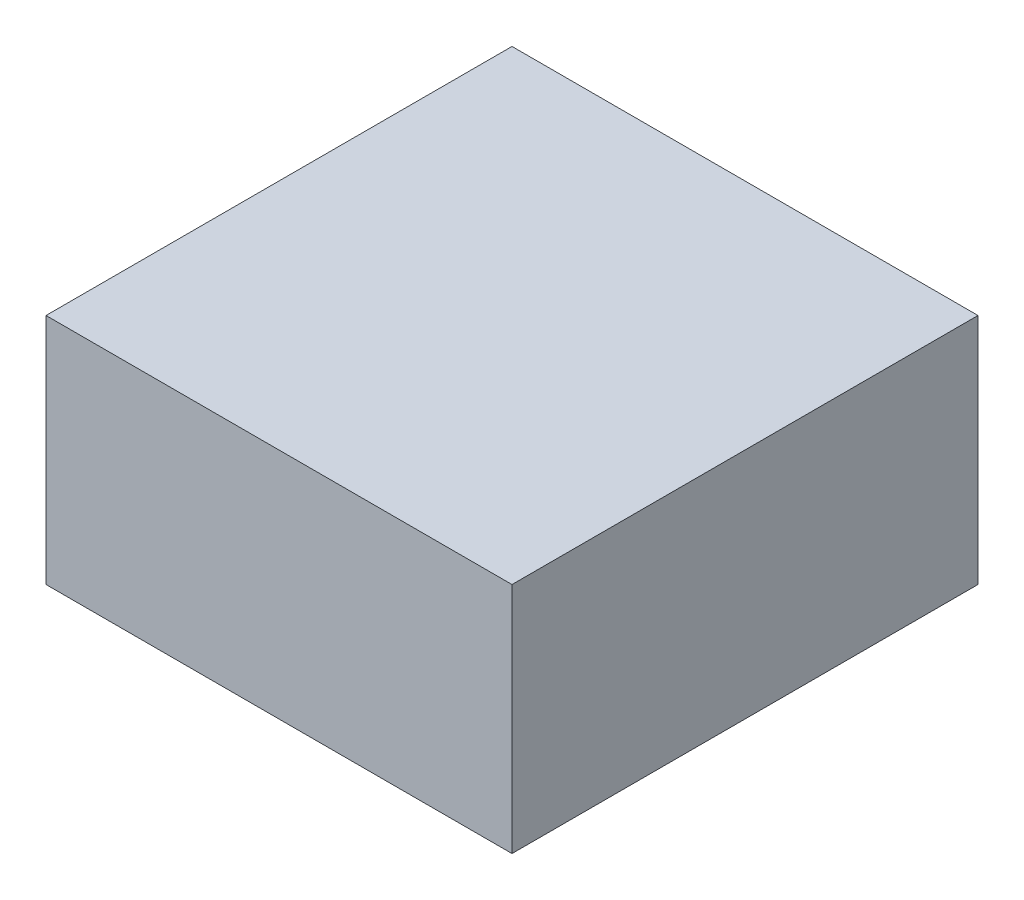
ISO-10303-21;
HEADER;
FILE_DESCRIPTION(('STEP AP214'),'2;1');
FILE_NAME('part.step','',(''),(''),'','','');
FILE_SCHEMA(('AUTOMOTIVE_DESIGN { 1 0 10303 214 1 1 1 1 }'));
ENDSEC;
DATA;
#1=APPLICATION_CONTEXT('core data for automotive mechanical design processes');
#2=APPLICATION_PROTOCOL_DEFINITION('international standard','automotive_design',2000,#1);
#3=PRODUCT_CONTEXT('',#1,'mechanical');
#4=PRODUCT('Part','Part','',(#3));
#5=PRODUCT_RELATED_PRODUCT_CATEGORY('part','',(#4));
#6=PRODUCT_DEFINITION_FORMATION('','',#4);
#7=PRODUCT_DEFINITION_CONTEXT('part definition',#1,'design');
#8=PRODUCT_DEFINITION('design','',#6,#7);
#9=PRODUCT_DEFINITION_SHAPE('','',#8);
#10=(LENGTH_UNIT() NAMED_UNIT(*) SI_UNIT(.MILLI.,.METRE.));
#11=(NAMED_UNIT(*) PLANE_ANGLE_UNIT() SI_UNIT($,.RADIAN.));
#12=(NAMED_UNIT(*) SI_UNIT($,.STERADIAN.) SOLID_ANGLE_UNIT());
#13=UNCERTAINTY_MEASURE_WITH_UNIT(LENGTH_MEASURE(1.E-05),#10,'distance_accuracy_value','');
#14=(GEOMETRIC_REPRESENTATION_CONTEXT(3) GLOBAL_UNCERTAINTY_ASSIGNED_CONTEXT((#13)) GLOBAL_UNIT_ASSIGNED_CONTEXT((#10,
#11,#12)) REPRESENTATION_CONTEXT('',''));
#15=CARTESIAN_POINT('',(0.,0.,0.));
#16=DIRECTION('',(0.,0.,1.));
#17=DIRECTION('',(1.,0.,0.));
#18=AXIS2_PLACEMENT_3D('',#15,#16,#17);
#19=CARTESIAN_POINT('',(0.,0.,6.));
#20=DIRECTION('',(0.,0.,1.));
#21=DIRECTION('',(1.,0.,0.));
#22=AXIS2_PLACEMENT_3D('',#19,#20,#21);
#23=PLANE('',#22);
#24=DIRECTION('',(-1.,0.,0.));
#25=VECTOR('',#24,1.);
#26=CARTESIAN_POINT('',(0.,-3.,6.));
#27=LINE('',#26,#25);
#28=CARTESIAN_POINT('',(6.,-3.,6.));
#29=VERTEX_POINT('',#28);
#30=CARTESIAN_POINT('',(-6.,-3.,6.));
#31=VERTEX_POINT('',#30);
#32=EDGE_CURVE('E11',#29,#31,#27,.T.);
#33=ORIENTED_EDGE('',*,*,#32,.F.);
#34=DIRECTION('',(0.,-1.,0.));
#35=VECTOR('',#34,1.);
#36=CARTESIAN_POINT('',(6.,0.,6.));
#37=LINE('',#36,#35);
#38=CARTESIAN_POINT('',(6.,3.,6.));
#39=VERTEX_POINT('',#38);
#40=EDGE_CURVE('E61',#39,#29,#37,.T.);
#41=ORIENTED_EDGE('',*,*,#40,.F.);
#42=DIRECTION('',(1.,0.,0.));
#43=VECTOR('',#42,1.);
#44=CARTESIAN_POINT('',(0.,3.,6.));
#45=LINE('',#44,#43);
#46=CARTESIAN_POINT('',(-6.,3.,6.));
#47=VERTEX_POINT('',#46);
#48=EDGE_CURVE('E87',#47,#39,#45,.T.);
#49=ORIENTED_EDGE('',*,*,#48,.F.);
#50=DIRECTION('',(0.,1.,0.));
#51=VECTOR('',#50,1.);
#52=CARTESIAN_POINT('',(-6.,0.,6.));
#53=LINE('',#52,#51);
#54=EDGE_CURVE('E24',#31,#47,#53,.T.);
#55=ORIENTED_EDGE('',*,*,#54,.F.);
#56=EDGE_LOOP('',(#33,#41,#49,#55));
#57=FACE_BOUND('',#56,.T.);
#58=ADVANCED_FACE('F17',(#57),#23,.T.);
#59=CARTESIAN_POINT('',(0.,-3.,-6.));
#60=DIRECTION('',(0.,-1.,0.));
#61=DIRECTION('',(0.,0.,-1.));
#62=AXIS2_PLACEMENT_3D('',#59,#60,#61);
#63=PLANE('',#62);
#64=DIRECTION('',(0.,0.,1.));
#65=VECTOR('',#64,1.);
#66=CARTESIAN_POINT('',(6.,-3.,-6.));
#67=LINE('',#66,#65);
#68=CARTESIAN_POINT('',(6.,-3.,-6.));
#69=VERTEX_POINT('',#68);
#70=EDGE_CURVE('E53',#69,#29,#67,.T.);
#71=ORIENTED_EDGE('',*,*,#70,.T.);
#72=ORIENTED_EDGE('',*,*,#32,.T.);
#73=DIRECTION('',(0.,0.,1.));
#74=VECTOR('',#73,1.);
#75=CARTESIAN_POINT('',(-6.,-3.,-6.));
#76=LINE('',#75,#74);
#77=CARTESIAN_POINT('',(-6.,-3.,-6.));
#78=VERTEX_POINT('',#77);
#79=EDGE_CURVE('E70',#78,#31,#76,.T.);
#80=ORIENTED_EDGE('',*,*,#79,.F.);
#81=DIRECTION('',(1.,0.,0.));
#82=VECTOR('',#81,1.);
#83=CARTESIAN_POINT('',(0.,-3.,-6.));
#84=LINE('',#83,#82);
#85=EDGE_CURVE('E65',#78,#69,#84,.T.);
#86=ORIENTED_EDGE('',*,*,#85,.T.);
#87=EDGE_LOOP('',(#71,#72,#80,#86));
#88=FACE_BOUND('',#87,.T.);
#89=ADVANCED_FACE('F66',(#88),#63,.T.);
#90=CARTESIAN_POINT('',(-6.,0.,-6.));
#91=DIRECTION('',(-1.,0.,0.));
#92=DIRECTION('',(0.,0.,1.));
#93=AXIS2_PLACEMENT_3D('',#90,#91,#92);
#94=PLANE('',#93);
#95=ORIENTED_EDGE('',*,*,#79,.T.);
#96=ORIENTED_EDGE('',*,*,#54,.T.);
#97=DIRECTION('',(0.,0.,1.));
#98=VECTOR('',#97,1.);
#99=CARTESIAN_POINT('',(-6.,3.,-6.));
#100=LINE('',#99,#98);
#101=CARTESIAN_POINT('',(-6.,3.,-6.));
#102=VERTEX_POINT('',#101);
#103=EDGE_CURVE('E85',#102,#47,#100,.T.);
#104=ORIENTED_EDGE('',*,*,#103,.F.);
#105=DIRECTION('',(0.,-1.,0.));
#106=VECTOR('',#105,1.);
#107=CARTESIAN_POINT('',(-6.,0.,-6.));
#108=LINE('',#107,#106);
#109=EDGE_CURVE('E75',#102,#78,#108,.T.);
#110=ORIENTED_EDGE('',*,*,#109,.T.);
#111=EDGE_LOOP('',(#95,#96,#104,#110));
#112=FACE_BOUND('',#111,.T.);
#113=ADVANCED_FACE('F93',(#112),#94,.T.);
#114=CARTESIAN_POINT('',(0.,3.,-6.));
#115=DIRECTION('',(0.,1.,0.));
#116=DIRECTION('',(0.,0.,1.));
#117=AXIS2_PLACEMENT_3D('',#114,#115,#116);
#118=PLANE('',#117);
#119=ORIENTED_EDGE('',*,*,#103,.T.);
#120=ORIENTED_EDGE('',*,*,#48,.T.);
#121=DIRECTION('',(0.,0.,1.));
#122=VECTOR('',#121,1.);
#123=CARTESIAN_POINT('',(6.,3.,-6.));
#124=LINE('',#123,#122);
#125=CARTESIAN_POINT('',(6.,3.,-6.));
#126=VERTEX_POINT('',#125);
#127=EDGE_CURVE('E62',#126,#39,#124,.T.);
#128=ORIENTED_EDGE('',*,*,#127,.F.);
#129=DIRECTION('',(-1.,0.,0.));
#130=VECTOR('',#129,1.);
#131=CARTESIAN_POINT('',(0.,3.,-6.));
#132=LINE('',#131,#130);
#133=EDGE_CURVE('E76',#126,#102,#132,.T.);
#134=ORIENTED_EDGE('',*,*,#133,.T.);
#135=EDGE_LOOP('',(#119,#120,#128,#134));
#136=FACE_BOUND('',#135,.T.);
#137=ADVANCED_FACE('F90',(#136),#118,.T.);
#138=CARTESIAN_POINT('',(0.,0.,-6.));
#139=DIRECTION('',(0.,0.,-1.));
#140=DIRECTION('',(-1.,0.,0.));
#141=AXIS2_PLACEMENT_3D('',#138,#139,#140);
#142=PLANE('',#141);
#143=DIRECTION('',(0.,1.,0.));
#144=VECTOR('',#143,1.);
#145=CARTESIAN_POINT('',(6.,0.,-6.));
#146=LINE('',#145,#144);
#147=EDGE_CURVE('E56',#69,#126,#146,.T.);
#148=ORIENTED_EDGE('',*,*,#147,.F.);
#149=ORIENTED_EDGE('',*,*,#85,.F.);
#150=ORIENTED_EDGE('',*,*,#109,.F.);
#151=ORIENTED_EDGE('',*,*,#133,.F.);
#152=EDGE_LOOP('',(#148,#149,#150,#151));
#153=FACE_BOUND('',#152,.T.);
#154=ADVANCED_FACE('F72',(#153),#142,.T.);
#155=CARTESIAN_POINT('',(6.,0.,-6.));
#156=DIRECTION('',(1.,0.,0.));
#157=DIRECTION('',(0.,0.,-1.));
#158=AXIS2_PLACEMENT_3D('',#155,#156,#157);
#159=PLANE('',#158);
#160=ORIENTED_EDGE('',*,*,#147,.T.);
#161=ORIENTED_EDGE('',*,*,#127,.T.);
#162=ORIENTED_EDGE('',*,*,#40,.T.);
#163=ORIENTED_EDGE('',*,*,#70,.F.);
#164=EDGE_LOOP('',(#160,#161,#162,#163));
#165=FACE_BOUND('',#164,.T.);
#166=ADVANCED_FACE('F57',(#165),#159,.T.);
#167=CLOSED_SHELL('',(#58,#89,#113,#137,#154,#166));
#168=MANIFOLD_SOLID_BREP('B1',#167);
#169=ADVANCED_BREP_SHAPE_REPRESENTATION('',(#18,#168),#14);
#170=SHAPE_DEFINITION_REPRESENTATION(#9,#169);
ENDSEC;
END-ISO-10303-21;
